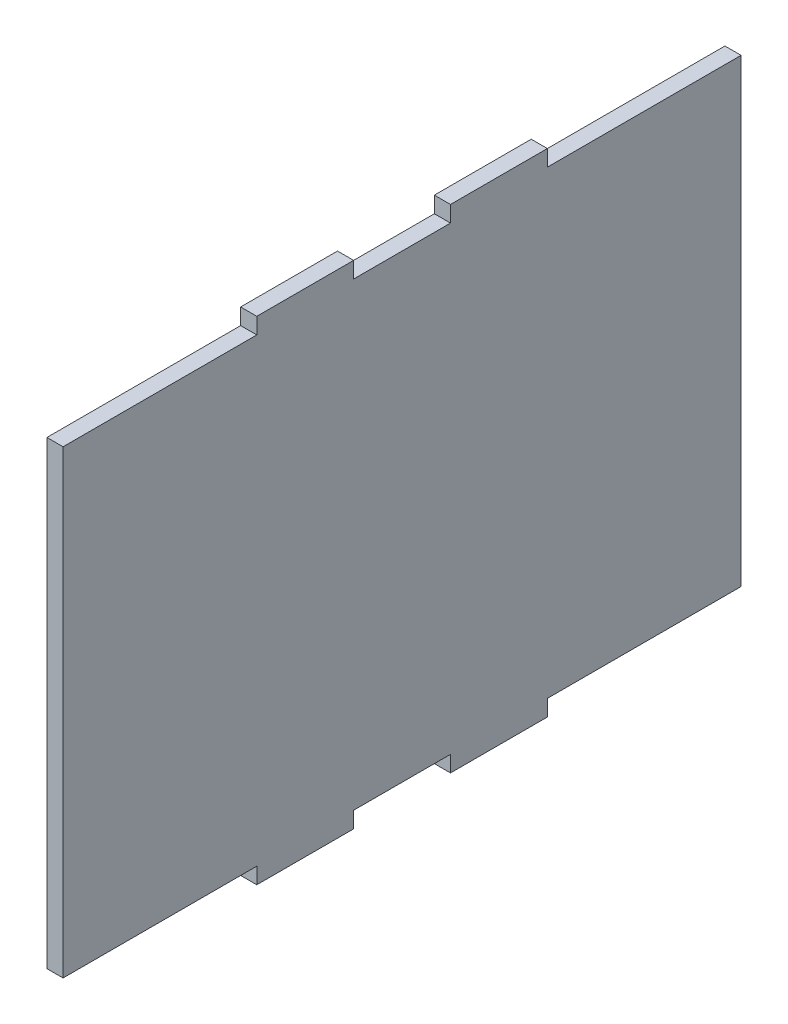
ISO-10303-21;
HEADER;
FILE_DESCRIPTION(('STEP AP214'),'2;1');
FILE_NAME('part.step','',(''),(''),'','','');
FILE_SCHEMA(('AUTOMOTIVE_DESIGN { 1 0 10303 214 1 1 1 1 }'));
ENDSEC;
DATA;
#1=APPLICATION_CONTEXT('core data for automotive mechanical design processes');
#2=APPLICATION_PROTOCOL_DEFINITION('international standard','automotive_design',2000,#1);
#3=PRODUCT_CONTEXT('',#1,'mechanical');
#4=PRODUCT('Part','Part','',(#3));
#5=PRODUCT_RELATED_PRODUCT_CATEGORY('part','',(#4));
#6=PRODUCT_DEFINITION_FORMATION('','',#4);
#7=PRODUCT_DEFINITION_CONTEXT('part definition',#1,'design');
#8=PRODUCT_DEFINITION('design','',#6,#7);
#9=PRODUCT_DEFINITION_SHAPE('','',#8);
#10=(LENGTH_UNIT() NAMED_UNIT(*) SI_UNIT(.MILLI.,.METRE.));
#11=(NAMED_UNIT(*) PLANE_ANGLE_UNIT() SI_UNIT($,.RADIAN.));
#12=(NAMED_UNIT(*) SI_UNIT($,.STERADIAN.) SOLID_ANGLE_UNIT());
#13=UNCERTAINTY_MEASURE_WITH_UNIT(LENGTH_MEASURE(1.E-05),#10,'distance_accuracy_value','');
#14=(GEOMETRIC_REPRESENTATION_CONTEXT(3) GLOBAL_UNCERTAINTY_ASSIGNED_CONTEXT((#13)) GLOBAL_UNIT_ASSIGNED_CONTEXT((#10,
#11,#12)) REPRESENTATION_CONTEXT('',''));
#15=CARTESIAN_POINT('',(0.,0.,0.));
#16=DIRECTION('',(0.,0.,1.));
#17=DIRECTION('',(1.,0.,0.));
#18=AXIS2_PLACEMENT_3D('',#15,#16,#17);
#19=CARTESIAN_POINT('',(10.,211.22153158164,328.894741548803));
#20=DIRECTION('',(0.,0.,-1.));
#21=DIRECTION('',(-1.,0.,0.));
#22=AXIS2_PLACEMENT_3D('',#19,#20,#21);
#23=PLANE('',#22);
#24=DIRECTION('',(0.,-1.,0.));
#25=VECTOR('',#24,1.);
#26=CARTESIAN_POINT('',(0.,211.22153158164,328.894741548803));
#27=LINE('',#26,#25);
#28=CARTESIAN_POINT('',(0.,211.22153158164,328.894741548803));
#29=VERTEX_POINT('',#28);
#30=CARTESIAN_POINT('',(0.,-73.7784684183598,328.894741548803));
#31=VERTEX_POINT('',#30);
#32=EDGE_CURVE('E201',#29,#31,#27,.T.);
#33=ORIENTED_EDGE('',*,*,#32,.T.);
#34=DIRECTION('',(-1.,0.,0.));
#35=VECTOR('',#34,1.);
#36=CARTESIAN_POINT('',(10.,-73.7784684183598,328.894741548803));
#37=LINE('',#36,#35);
#38=CARTESIAN_POINT('',(10.,-73.7784684183598,328.894741548803));
#39=VERTEX_POINT('',#38);
#40=EDGE_CURVE('E11',#39,#31,#37,.T.);
#41=ORIENTED_EDGE('',*,*,#40,.F.);
#42=DIRECTION('',(0.,-1.,0.));
#43=VECTOR('',#42,1.);
#44=CARTESIAN_POINT('',(10.,211.22153158164,328.894741548803));
#45=LINE('',#44,#43);
#46=CARTESIAN_POINT('',(10.,211.22153158164,328.894741548803));
#47=VERTEX_POINT('',#46);
#48=EDGE_CURVE('E239',#47,#39,#45,.T.);
#49=ORIENTED_EDGE('',*,*,#48,.F.);
#50=DIRECTION('',(-1.,0.,0.));
#51=VECTOR('',#50,1.);
#52=CARTESIAN_POINT('',(10.,211.22153158164,328.894741548803));
#53=LINE('',#52,#51);
#54=EDGE_CURVE('E197',#47,#29,#53,.T.);
#55=ORIENTED_EDGE('',*,*,#54,.T.);
#56=EDGE_LOOP('',(#33,#41,#49,#55));
#57=FACE_BOUND('',#56,.T.);
#58=ADVANCED_FACE('F33',(#57),#23,.F.);
#59=CARTESIAN_POINT('',(10.,-73.7784684183598,328.894741548803));
#60=DIRECTION('',(0.,1.,0.));
#61=DIRECTION('',(0.,0.,1.));
#62=AXIS2_PLACEMENT_3D('',#59,#60,#61);
#63=PLANE('',#62);
#64=DIRECTION('',(0.,0.,-1.));
#65=VECTOR('',#64,1.);
#66=CARTESIAN_POINT('',(0.,-73.7784684183598,328.894741548803));
#67=LINE('',#66,#65);
#68=CARTESIAN_POINT('',(0.,-73.7784684183598,208.894741548803));
#69=VERTEX_POINT('',#68);
#70=EDGE_CURVE('E204',#31,#69,#67,.T.);
#71=ORIENTED_EDGE('',*,*,#70,.T.);
#72=DIRECTION('',(-1.,0.,0.));
#73=VECTOR('',#72,1.);
#74=CARTESIAN_POINT('',(10.,-73.7784684183598,208.894741548803));
#75=LINE('',#74,#73);
#76=CARTESIAN_POINT('',(10.,-73.7784684183598,208.894741548803));
#77=VERTEX_POINT('',#76);
#78=EDGE_CURVE('E41',#77,#69,#75,.T.);
#79=ORIENTED_EDGE('',*,*,#78,.F.);
#80=DIRECTION('',(0.,0.,-1.));
#81=VECTOR('',#80,1.);
#82=CARTESIAN_POINT('',(10.,-73.7784684183598,328.894741548803));
#83=LINE('',#82,#81);
#84=EDGE_CURVE('E128',#39,#77,#83,.T.);
#85=ORIENTED_EDGE('',*,*,#84,.F.);
#86=ORIENTED_EDGE('',*,*,#40,.T.);
#87=EDGE_LOOP('',(#71,#79,#85,#86));
#88=FACE_BOUND('',#87,.T.);
#89=ADVANCED_FACE('F357',(#88),#63,.F.);
#90=CARTESIAN_POINT('',(10.,-73.7784684183598,208.894741548803));
#91=DIRECTION('',(0.,0.,-1.));
#92=DIRECTION('',(-1.,0.,0.));
#93=AXIS2_PLACEMENT_3D('',#90,#91,#92);
#94=PLANE('',#93);
#95=DIRECTION('',(0.,-1.,0.));
#96=VECTOR('',#95,1.);
#97=CARTESIAN_POINT('',(0.,-73.7784684183598,208.894741548803));
#98=LINE('',#97,#96);
#99=CARTESIAN_POINT('',(0.,-83.7784684183598,208.894741548803));
#100=VERTEX_POINT('',#99);
#101=EDGE_CURVE('E206',#69,#100,#98,.T.);
#102=ORIENTED_EDGE('',*,*,#101,.T.);
#103=DIRECTION('',(-1.,0.,0.));
#104=VECTOR('',#103,1.);
#105=CARTESIAN_POINT('',(10.,-83.7784684183598,208.894741548803));
#106=LINE('',#105,#104);
#107=CARTESIAN_POINT('',(10.,-83.7784684183598,208.894741548803));
#108=VERTEX_POINT('',#107);
#109=EDGE_CURVE('E282',#108,#100,#106,.T.);
#110=ORIENTED_EDGE('',*,*,#109,.F.);
#111=DIRECTION('',(0.,-1.,0.));
#112=VECTOR('',#111,1.);
#113=CARTESIAN_POINT('',(10.,-73.7784684183598,208.894741548803));
#114=LINE('',#113,#112);
#115=EDGE_CURVE('E290',#77,#108,#114,.T.);
#116=ORIENTED_EDGE('',*,*,#115,.F.);
#117=ORIENTED_EDGE('',*,*,#78,.T.);
#118=EDGE_LOOP('',(#102,#110,#116,#117));
#119=FACE_BOUND('',#118,.T.);
#120=ADVANCED_FACE('F288',(#119),#94,.F.);
#121=CARTESIAN_POINT('',(10.,-83.7784684183598,208.894741548803));
#122=DIRECTION('',(0.,1.,0.));
#123=DIRECTION('',(0.,0.,1.));
#124=AXIS2_PLACEMENT_3D('',#121,#122,#123);
#125=PLANE('',#124);
#126=DIRECTION('',(0.,0.,-1.));
#127=VECTOR('',#126,1.);
#128=CARTESIAN_POINT('',(0.,-83.7784684183598,208.894741548803));
#129=LINE('',#128,#127);
#130=CARTESIAN_POINT('',(0.,-83.7784684183598,148.894741548803));
#131=VERTEX_POINT('',#130);
#132=EDGE_CURVE('E208',#100,#131,#129,.T.);
#133=ORIENTED_EDGE('',*,*,#132,.T.);
#134=DIRECTION('',(-1.,0.,0.));
#135=VECTOR('',#134,1.);
#136=CARTESIAN_POINT('',(10.,-83.7784684183598,148.894741548803));
#137=LINE('',#136,#135);
#138=CARTESIAN_POINT('',(10.,-83.7784684183598,148.894741548803));
#139=VERTEX_POINT('',#138);
#140=EDGE_CURVE('E279',#139,#131,#137,.T.);
#141=ORIENTED_EDGE('',*,*,#140,.F.);
#142=DIRECTION('',(0.,0.,-1.));
#143=VECTOR('',#142,1.);
#144=CARTESIAN_POINT('',(10.,-83.7784684183598,208.894741548803));
#145=LINE('',#144,#143);
#146=EDGE_CURVE('E308',#108,#139,#145,.T.);
#147=ORIENTED_EDGE('',*,*,#146,.F.);
#148=ORIENTED_EDGE('',*,*,#109,.T.);
#149=EDGE_LOOP('',(#133,#141,#147,#148));
#150=FACE_BOUND('',#149,.T.);
#151=ADVANCED_FACE('F299',(#150),#125,.F.);
#152=CARTESIAN_POINT('',(10.,-83.7784684183598,148.894741548803));
#153=DIRECTION('',(0.,0.,1.));
#154=DIRECTION('',(1.,0.,0.));
#155=AXIS2_PLACEMENT_3D('',#152,#153,#154);
#156=PLANE('',#155);
#157=DIRECTION('',(0.,1.,0.));
#158=VECTOR('',#157,1.);
#159=CARTESIAN_POINT('',(0.,-83.7784684183598,148.894741548803));
#160=LINE('',#159,#158);
#161=CARTESIAN_POINT('',(0.,-73.7784684183598,148.894741548803));
#162=VERTEX_POINT('',#161);
#163=EDGE_CURVE('E210',#131,#162,#160,.T.);
#164=ORIENTED_EDGE('',*,*,#163,.T.);
#165=DIRECTION('',(-1.,0.,0.));
#166=VECTOR('',#165,1.);
#167=CARTESIAN_POINT('',(10.,-73.7784684183598,148.894741548803));
#168=LINE('',#167,#166);
#169=CARTESIAN_POINT('',(10.,-73.7784684183598,148.894741548803));
#170=VERTEX_POINT('',#169);
#171=EDGE_CURVE('E276',#170,#162,#168,.T.);
#172=ORIENTED_EDGE('',*,*,#171,.F.);
#173=DIRECTION('',(0.,1.,0.));
#174=VECTOR('',#173,1.);
#175=CARTESIAN_POINT('',(10.,-83.7784684183598,148.894741548803));
#176=LINE('',#175,#174);
#177=EDGE_CURVE('E305',#139,#170,#176,.T.);
#178=ORIENTED_EDGE('',*,*,#177,.F.);
#179=ORIENTED_EDGE('',*,*,#140,.T.);
#180=EDGE_LOOP('',(#164,#172,#178,#179));
#181=FACE_BOUND('',#180,.T.);
#182=ADVANCED_FACE('F303',(#181),#156,.F.);
#183=CARTESIAN_POINT('',(10.,-73.7784684183598,148.894741548803));
#184=DIRECTION('',(0.,1.,0.));
#185=DIRECTION('',(0.,0.,1.));
#186=AXIS2_PLACEMENT_3D('',#183,#184,#185);
#187=PLANE('',#186);
#188=DIRECTION('',(0.,0.,-1.));
#189=VECTOR('',#188,1.);
#190=CARTESIAN_POINT('',(0.,-73.7784684183598,148.894741548803));
#191=LINE('',#190,#189);
#192=CARTESIAN_POINT('',(0.,-73.7784684183598,88.8947415488026));
#193=VERTEX_POINT('',#192);
#194=EDGE_CURVE('E212',#162,#193,#191,.T.);
#195=ORIENTED_EDGE('',*,*,#194,.T.);
#196=DIRECTION('',(-1.,0.,0.));
#197=VECTOR('',#196,1.);
#198=CARTESIAN_POINT('',(10.,-73.7784684183598,88.8947415488026));
#199=LINE('',#198,#197);
#200=CARTESIAN_POINT('',(10.,-73.7784684183598,88.8947415488026));
#201=VERTEX_POINT('',#200);
#202=EDGE_CURVE('E273',#201,#193,#199,.T.);
#203=ORIENTED_EDGE('',*,*,#202,.F.);
#204=DIRECTION('',(0.,0.,-1.));
#205=VECTOR('',#204,1.);
#206=CARTESIAN_POINT('',(10.,-73.7784684183598,148.894741548803));
#207=LINE('',#206,#205);
#208=EDGE_CURVE('E307',#170,#201,#207,.T.);
#209=ORIENTED_EDGE('',*,*,#208,.F.);
#210=ORIENTED_EDGE('',*,*,#171,.T.);
#211=EDGE_LOOP('',(#195,#203,#209,#210));
#212=FACE_BOUND('',#211,.T.);
#213=ADVANCED_FACE('F370',(#212),#187,.F.);
#214=CARTESIAN_POINT('',(10.,-73.7784684183598,88.8947415488026));
#215=DIRECTION('',(0.,0.,-1.));
#216=DIRECTION('',(-1.,0.,0.));
#217=AXIS2_PLACEMENT_3D('',#214,#215,#216);
#218=PLANE('',#217);
#219=DIRECTION('',(0.,-1.,0.));
#220=VECTOR('',#219,1.);
#221=CARTESIAN_POINT('',(0.,-73.7784684183598,88.8947415488026));
#222=LINE('',#221,#220);
#223=CARTESIAN_POINT('',(0.,-83.7784684183598,88.8947415488026));
#224=VERTEX_POINT('',#223);
#225=EDGE_CURVE('E214',#193,#224,#222,.T.);
#226=ORIENTED_EDGE('',*,*,#225,.T.);
#227=DIRECTION('',(-1.,0.,0.));
#228=VECTOR('',#227,1.);
#229=CARTESIAN_POINT('',(10.,-83.7784684183598,88.8947415488026));
#230=LINE('',#229,#228);
#231=CARTESIAN_POINT('',(10.,-83.7784684183598,88.8947415488026));
#232=VERTEX_POINT('',#231);
#233=EDGE_CURVE('E270',#232,#224,#230,.T.);
#234=ORIENTED_EDGE('',*,*,#233,.F.);
#235=DIRECTION('',(0.,-1.,0.));
#236=VECTOR('',#235,1.);
#237=CARTESIAN_POINT('',(10.,-73.7784684183598,88.8947415488026));
#238=LINE('',#237,#236);
#239=EDGE_CURVE('E310',#201,#232,#238,.T.);
#240=ORIENTED_EDGE('',*,*,#239,.F.);
#241=ORIENTED_EDGE('',*,*,#202,.T.);
#242=EDGE_LOOP('',(#226,#234,#240,#241));
#243=FACE_BOUND('',#242,.T.);
#244=ADVANCED_FACE('F373',(#243),#218,.F.);
#245=CARTESIAN_POINT('',(10.,-83.7784684183598,88.8947415488026));
#246=DIRECTION('',(0.,1.,0.));
#247=DIRECTION('',(0.,0.,1.));
#248=AXIS2_PLACEMENT_3D('',#245,#246,#247);
#249=PLANE('',#248);
#250=DIRECTION('',(0.,0.,-1.));
#251=VECTOR('',#250,1.);
#252=CARTESIAN_POINT('',(0.,-83.7784684183598,88.8947415488026));
#253=LINE('',#252,#251);
#254=CARTESIAN_POINT('',(0.,-83.7784684183598,28.8947415488026));
#255=VERTEX_POINT('',#254);
#256=EDGE_CURVE('E216',#224,#255,#253,.T.);
#257=ORIENTED_EDGE('',*,*,#256,.T.);
#258=DIRECTION('',(-1.,0.,0.));
#259=VECTOR('',#258,1.);
#260=CARTESIAN_POINT('',(10.,-83.7784684183598,28.8947415488026));
#261=LINE('',#260,#259);
#262=CARTESIAN_POINT('',(10.,-83.7784684183598,28.8947415488026));
#263=VERTEX_POINT('',#262);
#264=EDGE_CURVE('E267',#263,#255,#261,.T.);
#265=ORIENTED_EDGE('',*,*,#264,.F.);
#266=DIRECTION('',(0.,0.,-1.));
#267=VECTOR('',#266,1.);
#268=CARTESIAN_POINT('',(10.,-83.7784684183598,88.8947415488026));
#269=LINE('',#268,#267);
#270=EDGE_CURVE('E316',#232,#263,#269,.T.);
#271=ORIENTED_EDGE('',*,*,#270,.F.);
#272=ORIENTED_EDGE('',*,*,#233,.T.);
#273=EDGE_LOOP('',(#257,#265,#271,#272));
#274=FACE_BOUND('',#273,.T.);
#275=ADVANCED_FACE('F377',(#274),#249,.F.);
#276=CARTESIAN_POINT('',(10.,-83.7784684183598,28.8947415488026));
#277=DIRECTION('',(0.,0.,1.));
#278=DIRECTION('',(1.,0.,0.));
#279=AXIS2_PLACEMENT_3D('',#276,#277,#278);
#280=PLANE('',#279);
#281=DIRECTION('',(0.,1.,0.));
#282=VECTOR('',#281,1.);
#283=CARTESIAN_POINT('',(0.,-83.7784684183598,28.8947415488026));
#284=LINE('',#283,#282);
#285=CARTESIAN_POINT('',(0.,-73.7784684183598,28.8947415488026));
#286=VERTEX_POINT('',#285);
#287=EDGE_CURVE('E218',#255,#286,#284,.T.);
#288=ORIENTED_EDGE('',*,*,#287,.T.);
#289=DIRECTION('',(-1.,0.,0.));
#290=VECTOR('',#289,1.);
#291=CARTESIAN_POINT('',(10.,-73.7784684183598,28.8947415488026));
#292=LINE('',#291,#290);
#293=CARTESIAN_POINT('',(10.,-73.7784684183598,28.8947415488026));
#294=VERTEX_POINT('',#293);
#295=EDGE_CURVE('E264',#294,#286,#292,.T.);
#296=ORIENTED_EDGE('',*,*,#295,.F.);
#297=DIRECTION('',(0.,1.,0.));
#298=VECTOR('',#297,1.);
#299=CARTESIAN_POINT('',(10.,-83.7784684183598,28.8947415488026));
#300=LINE('',#299,#298);
#301=EDGE_CURVE('E318',#263,#294,#300,.T.);
#302=ORIENTED_EDGE('',*,*,#301,.F.);
#303=ORIENTED_EDGE('',*,*,#264,.T.);
#304=EDGE_LOOP('',(#288,#296,#302,#303));
#305=FACE_BOUND('',#304,.T.);
#306=ADVANCED_FACE('F381',(#305),#280,.F.);
#307=CARTESIAN_POINT('',(10.,-73.7784684183598,28.8947415488026));
#308=DIRECTION('',(0.,1.,0.));
#309=DIRECTION('',(0.,0.,1.));
#310=AXIS2_PLACEMENT_3D('',#307,#308,#309);
#311=PLANE('',#310);
#312=DIRECTION('',(0.,0.,-1.));
#313=VECTOR('',#312,1.);
#314=CARTESIAN_POINT('',(0.,-73.7784684183598,28.8947415488026));
#315=LINE('',#314,#313);
#316=CARTESIAN_POINT('',(0.,-73.7784684183598,-91.1052584511975));
#317=VERTEX_POINT('',#316);
#318=EDGE_CURVE('E220',#286,#317,#315,.T.);
#319=ORIENTED_EDGE('',*,*,#318,.T.);
#320=DIRECTION('',(-1.,0.,0.));
#321=VECTOR('',#320,1.);
#322=CARTESIAN_POINT('',(10.,-73.7784684183598,-91.1052584511975));
#323=LINE('',#322,#321);
#324=CARTESIAN_POINT('',(10.,-73.7784684183598,-91.1052584511975));
#325=VERTEX_POINT('',#324);
#326=EDGE_CURVE('E261',#325,#317,#323,.T.);
#327=ORIENTED_EDGE('',*,*,#326,.F.);
#328=DIRECTION('',(0.,0.,-1.));
#329=VECTOR('',#328,1.);
#330=CARTESIAN_POINT('',(10.,-73.7784684183598,28.8947415488026));
#331=LINE('',#330,#329);
#332=EDGE_CURVE('E320',#294,#325,#331,.T.);
#333=ORIENTED_EDGE('',*,*,#332,.F.);
#334=ORIENTED_EDGE('',*,*,#295,.T.);
#335=EDGE_LOOP('',(#319,#327,#333,#334));
#336=FACE_BOUND('',#335,.T.);
#337=ADVANCED_FACE('F385',(#336),#311,.F.);
#338=CARTESIAN_POINT('',(10.,211.22153158164,-91.1052584511975));
#339=DIRECTION('',(0.,0.,1.));
#340=DIRECTION('',(1.,0.,0.));
#341=AXIS2_PLACEMENT_3D('',#338,#339,#340);
#342=PLANE('',#341);
#343=DIRECTION('',(0.,1.,0.));
#344=VECTOR('',#343,1.);
#345=CARTESIAN_POINT('',(0.,211.22153158164,-91.1052584511975));
#346=LINE('',#345,#344);
#347=CARTESIAN_POINT('',(0.,211.22153158164,-91.1052584511975));
#348=VERTEX_POINT('',#347);
#349=EDGE_CURVE('E222',#317,#348,#346,.T.);
#350=ORIENTED_EDGE('',*,*,#349,.T.);
#351=DIRECTION('',(-1.,0.,0.));
#352=VECTOR('',#351,1.);
#353=CARTESIAN_POINT('',(10.,211.22153158164,-91.1052584511975));
#354=LINE('',#353,#352);
#355=CARTESIAN_POINT('',(10.,211.22153158164,-91.1052584511975));
#356=VERTEX_POINT('',#355);
#357=EDGE_CURVE('E258',#356,#348,#354,.T.);
#358=ORIENTED_EDGE('',*,*,#357,.F.);
#359=DIRECTION('',(0.,1.,0.));
#360=VECTOR('',#359,1.);
#361=CARTESIAN_POINT('',(10.,211.22153158164,-91.1052584511975));
#362=LINE('',#361,#360);
#363=EDGE_CURVE('E322',#325,#356,#362,.T.);
#364=ORIENTED_EDGE('',*,*,#363,.F.);
#365=ORIENTED_EDGE('',*,*,#326,.T.);
#366=EDGE_LOOP('',(#350,#358,#364,#365));
#367=FACE_BOUND('',#366,.T.);
#368=ADVANCED_FACE('F389',(#367),#342,.F.);
#369=CARTESIAN_POINT('',(10.,211.22153158164,28.8947415488026));
#370=DIRECTION('',(0.,-1.,0.));
#371=DIRECTION('',(0.,0.,-1.));
#372=AXIS2_PLACEMENT_3D('',#369,#370,#371);
#373=PLANE('',#372);
#374=DIRECTION('',(0.,0.,1.));
#375=VECTOR('',#374,1.);
#376=CARTESIAN_POINT('',(0.,211.22153158164,28.8947415488026));
#377=LINE('',#376,#375);
#378=CARTESIAN_POINT('',(0.,211.22153158164,28.8947415488026));
#379=VERTEX_POINT('',#378);
#380=EDGE_CURVE('E224',#348,#379,#377,.T.);
#381=ORIENTED_EDGE('',*,*,#380,.T.);
#382=DIRECTION('',(-1.,0.,0.));
#383=VECTOR('',#382,1.);
#384=CARTESIAN_POINT('',(10.,211.22153158164,28.8947415488026));
#385=LINE('',#384,#383);
#386=CARTESIAN_POINT('',(10.,211.22153158164,28.8947415488026));
#387=VERTEX_POINT('',#386);
#388=EDGE_CURVE('E255',#387,#379,#385,.T.);
#389=ORIENTED_EDGE('',*,*,#388,.F.);
#390=DIRECTION('',(0.,0.,1.));
#391=VECTOR('',#390,1.);
#392=CARTESIAN_POINT('',(10.,211.22153158164,28.8947415488026));
#393=LINE('',#392,#391);
#394=EDGE_CURVE('E324',#356,#387,#393,.T.);
#395=ORIENTED_EDGE('',*,*,#394,.F.);
#396=ORIENTED_EDGE('',*,*,#357,.T.);
#397=EDGE_LOOP('',(#381,#389,#395,#396));
#398=FACE_BOUND('',#397,.T.);
#399=ADVANCED_FACE('F393',(#398),#373,.F.);
#400=CARTESIAN_POINT('',(10.,221.22153158164,28.8947415488026));
#401=DIRECTION('',(0.,0.,1.));
#402=DIRECTION('',(1.,0.,0.));
#403=AXIS2_PLACEMENT_3D('',#400,#401,#402);
#404=PLANE('',#403);
#405=DIRECTION('',(0.,1.,0.));
#406=VECTOR('',#405,1.);
#407=CARTESIAN_POINT('',(0.,221.22153158164,28.8947415488026));
#408=LINE('',#407,#406);
#409=CARTESIAN_POINT('',(0.,221.22153158164,28.8947415488026));
#410=VERTEX_POINT('',#409);
#411=EDGE_CURVE('E226',#379,#410,#408,.T.);
#412=ORIENTED_EDGE('',*,*,#411,.T.);
#413=DIRECTION('',(-1.,0.,0.));
#414=VECTOR('',#413,1.);
#415=CARTESIAN_POINT('',(10.,221.22153158164,28.8947415488026));
#416=LINE('',#415,#414);
#417=CARTESIAN_POINT('',(10.,221.22153158164,28.8947415488026));
#418=VERTEX_POINT('',#417);
#419=EDGE_CURVE('E252',#418,#410,#416,.T.);
#420=ORIENTED_EDGE('',*,*,#419,.F.);
#421=DIRECTION('',(0.,1.,0.));
#422=VECTOR('',#421,1.);
#423=CARTESIAN_POINT('',(10.,221.22153158164,28.8947415488026));
#424=LINE('',#423,#422);
#425=EDGE_CURVE('E326',#387,#418,#424,.T.);
#426=ORIENTED_EDGE('',*,*,#425,.F.);
#427=ORIENTED_EDGE('',*,*,#388,.T.);
#428=EDGE_LOOP('',(#412,#420,#426,#427));
#429=FACE_BOUND('',#428,.T.);
#430=ADVANCED_FACE('F397',(#429),#404,.F.);
#431=CARTESIAN_POINT('',(10.,221.22153158164,88.8947415488026));
#432=DIRECTION('',(0.,-1.,0.));
#433=DIRECTION('',(0.,0.,-1.));
#434=AXIS2_PLACEMENT_3D('',#431,#432,#433);
#435=PLANE('',#434);
#436=DIRECTION('',(0.,0.,1.));
#437=VECTOR('',#436,1.);
#438=CARTESIAN_POINT('',(0.,221.22153158164,88.8947415488026));
#439=LINE('',#438,#437);
#440=CARTESIAN_POINT('',(0.,221.22153158164,88.8947415488026));
#441=VERTEX_POINT('',#440);
#442=EDGE_CURVE('E228',#410,#441,#439,.T.);
#443=ORIENTED_EDGE('',*,*,#442,.T.);
#444=DIRECTION('',(-1.,0.,0.));
#445=VECTOR('',#444,1.);
#446=CARTESIAN_POINT('',(10.,221.22153158164,88.8947415488026));
#447=LINE('',#446,#445);
#448=CARTESIAN_POINT('',(10.,221.22153158164,88.8947415488026));
#449=VERTEX_POINT('',#448);
#450=EDGE_CURVE('E249',#449,#441,#447,.T.);
#451=ORIENTED_EDGE('',*,*,#450,.F.);
#452=DIRECTION('',(0.,0.,1.));
#453=VECTOR('',#452,1.);
#454=CARTESIAN_POINT('',(10.,221.22153158164,88.8947415488026));
#455=LINE('',#454,#453);
#456=EDGE_CURVE('E328',#418,#449,#455,.T.);
#457=ORIENTED_EDGE('',*,*,#456,.F.);
#458=ORIENTED_EDGE('',*,*,#419,.T.);
#459=EDGE_LOOP('',(#443,#451,#457,#458));
#460=FACE_BOUND('',#459,.T.);
#461=ADVANCED_FACE('F401',(#460),#435,.F.);
#462=CARTESIAN_POINT('',(10.,211.22153158164,88.8947415488026));
#463=DIRECTION('',(0.,0.,-1.));
#464=DIRECTION('',(-1.,0.,0.));
#465=AXIS2_PLACEMENT_3D('',#462,#463,#464);
#466=PLANE('',#465);
#467=DIRECTION('',(0.,-1.,0.));
#468=VECTOR('',#467,1.);
#469=CARTESIAN_POINT('',(0.,211.22153158164,88.8947415488026));
#470=LINE('',#469,#468);
#471=CARTESIAN_POINT('',(0.,211.22153158164,88.8947415488026));
#472=VERTEX_POINT('',#471);
#473=EDGE_CURVE('E230',#441,#472,#470,.T.);
#474=ORIENTED_EDGE('',*,*,#473,.T.);
#475=DIRECTION('',(-1.,0.,0.));
#476=VECTOR('',#475,1.);
#477=CARTESIAN_POINT('',(10.,211.22153158164,88.8947415488026));
#478=LINE('',#477,#476);
#479=CARTESIAN_POINT('',(10.,211.22153158164,88.8947415488026));
#480=VERTEX_POINT('',#479);
#481=EDGE_CURVE('E246',#480,#472,#478,.T.);
#482=ORIENTED_EDGE('',*,*,#481,.F.);
#483=DIRECTION('',(0.,-1.,0.));
#484=VECTOR('',#483,1.);
#485=CARTESIAN_POINT('',(10.,211.22153158164,88.8947415488026));
#486=LINE('',#485,#484);
#487=EDGE_CURVE('E330',#449,#480,#486,.T.);
#488=ORIENTED_EDGE('',*,*,#487,.F.);
#489=ORIENTED_EDGE('',*,*,#450,.T.);
#490=EDGE_LOOP('',(#474,#482,#488,#489));
#491=FACE_BOUND('',#490,.T.);
#492=ADVANCED_FACE('F405',(#491),#466,.F.);
#493=CARTESIAN_POINT('',(10.,211.22153158164,148.894741548803));
#494=DIRECTION('',(0.,-1.,0.));
#495=DIRECTION('',(0.,0.,-1.));
#496=AXIS2_PLACEMENT_3D('',#493,#494,#495);
#497=PLANE('',#496);
#498=DIRECTION('',(0.,0.,1.));
#499=VECTOR('',#498,1.);
#500=CARTESIAN_POINT('',(0.,211.22153158164,148.894741548803));
#501=LINE('',#500,#499);
#502=CARTESIAN_POINT('',(0.,211.22153158164,148.894741548803));
#503=VERTEX_POINT('',#502);
#504=EDGE_CURVE('E232',#472,#503,#501,.T.);
#505=ORIENTED_EDGE('',*,*,#504,.T.);
#506=DIRECTION('',(-1.,0.,0.));
#507=VECTOR('',#506,1.);
#508=CARTESIAN_POINT('',(10.,211.22153158164,148.894741548803));
#509=LINE('',#508,#507);
#510=CARTESIAN_POINT('',(10.,211.22153158164,148.894741548803));
#511=VERTEX_POINT('',#510);
#512=EDGE_CURVE('E243',#511,#503,#509,.T.);
#513=ORIENTED_EDGE('',*,*,#512,.F.);
#514=DIRECTION('',(0.,0.,1.));
#515=VECTOR('',#514,1.);
#516=CARTESIAN_POINT('',(10.,211.22153158164,148.894741548803));
#517=LINE('',#516,#515);
#518=EDGE_CURVE('E332',#480,#511,#517,.T.);
#519=ORIENTED_EDGE('',*,*,#518,.F.);
#520=ORIENTED_EDGE('',*,*,#481,.T.);
#521=EDGE_LOOP('',(#505,#513,#519,#520));
#522=FACE_BOUND('',#521,.T.);
#523=ADVANCED_FACE('F338',(#522),#497,.F.);
#524=CARTESIAN_POINT('',(10.,221.22153158164,148.894741548803));
#525=DIRECTION('',(0.,0.,1.));
#526=DIRECTION('',(1.,0.,0.));
#527=AXIS2_PLACEMENT_3D('',#524,#525,#526);
#528=PLANE('',#527);
#529=DIRECTION('',(0.,1.,0.));
#530=VECTOR('',#529,1.);
#531=CARTESIAN_POINT('',(0.,221.22153158164,148.894741548803));
#532=LINE('',#531,#530);
#533=CARTESIAN_POINT('',(0.,221.22153158164,148.894741548803));
#534=VERTEX_POINT('',#533);
#535=EDGE_CURVE('E234',#503,#534,#532,.T.);
#536=ORIENTED_EDGE('',*,*,#535,.T.);
#537=DIRECTION('',(-1.,0.,0.));
#538=VECTOR('',#537,1.);
#539=CARTESIAN_POINT('',(10.,221.22153158164,148.894741548803));
#540=LINE('',#539,#538);
#541=CARTESIAN_POINT('',(10.,221.22153158164,148.894741548803));
#542=VERTEX_POINT('',#541);
#543=EDGE_CURVE('E192',#542,#534,#540,.T.);
#544=ORIENTED_EDGE('',*,*,#543,.F.);
#545=DIRECTION('',(0.,1.,0.));
#546=VECTOR('',#545,1.);
#547=CARTESIAN_POINT('',(10.,221.22153158164,148.894741548803));
#548=LINE('',#547,#546);
#549=EDGE_CURVE('E183',#511,#542,#548,.T.);
#550=ORIENTED_EDGE('',*,*,#549,.F.);
#551=ORIENTED_EDGE('',*,*,#512,.T.);
#552=EDGE_LOOP('',(#536,#544,#550,#551));
#553=FACE_BOUND('',#552,.T.);
#554=ADVANCED_FACE('F342',(#553),#528,.F.);
#555=CARTESIAN_POINT('',(10.,221.22153158164,208.894741548803));
#556=DIRECTION('',(0.,-1.,0.));
#557=DIRECTION('',(0.,0.,-1.));
#558=AXIS2_PLACEMENT_3D('',#555,#556,#557);
#559=PLANE('',#558);
#560=DIRECTION('',(0.,0.,1.));
#561=VECTOR('',#560,1.);
#562=CARTESIAN_POINT('',(0.,221.22153158164,208.894741548803));
#563=LINE('',#562,#561);
#564=CARTESIAN_POINT('',(0.,221.22153158164,208.894741548803));
#565=VERTEX_POINT('',#564);
#566=EDGE_CURVE('E191',#534,#565,#563,.T.);
#567=ORIENTED_EDGE('',*,*,#566,.T.);
#568=DIRECTION('',(-1.,0.,0.));
#569=VECTOR('',#568,1.);
#570=CARTESIAN_POINT('',(10.,221.22153158164,208.894741548803));
#571=LINE('',#570,#569);
#572=CARTESIAN_POINT('',(10.,221.22153158164,208.894741548803));
#573=VERTEX_POINT('',#572);
#574=EDGE_CURVE('E188',#573,#565,#571,.T.);
#575=ORIENTED_EDGE('',*,*,#574,.F.);
#576=DIRECTION('',(0.,0.,1.));
#577=VECTOR('',#576,1.);
#578=CARTESIAN_POINT('',(10.,221.22153158164,208.894741548803));
#579=LINE('',#578,#577);
#580=EDGE_CURVE('E177',#542,#573,#579,.T.);
#581=ORIENTED_EDGE('',*,*,#580,.F.);
#582=ORIENTED_EDGE('',*,*,#543,.T.);
#583=EDGE_LOOP('',(#567,#575,#581,#582));
#584=FACE_BOUND('',#583,.T.);
#585=ADVANCED_FACE('F189',(#584),#559,.F.);
#586=CARTESIAN_POINT('',(10.,211.22153158164,208.894741548803));
#587=DIRECTION('',(0.,0.,-1.));
#588=DIRECTION('',(-1.,0.,0.));
#589=AXIS2_PLACEMENT_3D('',#586,#587,#588);
#590=PLANE('',#589);
#591=DIRECTION('',(0.,-1.,0.));
#592=VECTOR('',#591,1.);
#593=CARTESIAN_POINT('',(0.,211.22153158164,208.894741548803));
#594=LINE('',#593,#592);
#595=CARTESIAN_POINT('',(0.,211.22153158164,208.894741548803));
#596=VERTEX_POINT('',#595);
#597=EDGE_CURVE('E114',#565,#596,#594,.T.);
#598=ORIENTED_EDGE('',*,*,#597,.T.);
#599=DIRECTION('',(-1.,0.,0.));
#600=VECTOR('',#599,1.);
#601=CARTESIAN_POINT('',(10.,211.22153158164,208.894741548803));
#602=LINE('',#601,#600);
#603=CARTESIAN_POINT('',(10.,211.22153158164,208.894741548803));
#604=VERTEX_POINT('',#603);
#605=EDGE_CURVE('E193',#604,#596,#602,.T.);
#606=ORIENTED_EDGE('',*,*,#605,.F.);
#607=DIRECTION('',(0.,-1.,0.));
#608=VECTOR('',#607,1.);
#609=CARTESIAN_POINT('',(10.,211.22153158164,208.894741548803));
#610=LINE('',#609,#608);
#611=EDGE_CURVE('E181',#573,#604,#610,.T.);
#612=ORIENTED_EDGE('',*,*,#611,.F.);
#613=ORIENTED_EDGE('',*,*,#574,.T.);
#614=EDGE_LOOP('',(#598,#606,#612,#613));
#615=FACE_BOUND('',#614,.T.);
#616=ADVANCED_FACE('F195',(#615),#590,.F.);
#617=CARTESIAN_POINT('',(10.,211.22153158164,328.894741548803));
#618=DIRECTION('',(0.,-1.,0.));
#619=DIRECTION('',(0.,0.,-1.));
#620=AXIS2_PLACEMENT_3D('',#617,#618,#619);
#621=PLANE('',#620);
#622=DIRECTION('',(0.,0.,1.));
#623=VECTOR('',#622,1.);
#624=CARTESIAN_POINT('',(0.,211.22153158164,328.894741548803));
#625=LINE('',#624,#623);
#626=EDGE_CURVE('E120',#596,#29,#625,.T.);
#627=ORIENTED_EDGE('',*,*,#626,.T.);
#628=ORIENTED_EDGE('',*,*,#54,.F.);
#629=DIRECTION('',(0.,0.,1.));
#630=VECTOR('',#629,1.);
#631=CARTESIAN_POINT('',(10.,211.22153158164,328.894741548803));
#632=LINE('',#631,#630);
#633=EDGE_CURVE('E49',#604,#47,#632,.T.);
#634=ORIENTED_EDGE('',*,*,#633,.F.);
#635=ORIENTED_EDGE('',*,*,#605,.T.);
#636=EDGE_LOOP('',(#627,#628,#634,#635));
#637=FACE_BOUND('',#636,.T.);
#638=ADVANCED_FACE('F346',(#637),#621,.F.);
#639=CARTESIAN_POINT('',(10.,0.,0.));
#640=DIRECTION('',(1.,0.,0.));
#641=DIRECTION('',(0.,0.,-1.));
#642=AXIS2_PLACEMENT_3D('',#639,#640,#641);
#643=PLANE('',#642);
#644=ORIENTED_EDGE('',*,*,#48,.T.);
#645=ORIENTED_EDGE('',*,*,#84,.T.);
#646=ORIENTED_EDGE('',*,*,#115,.T.);
#647=ORIENTED_EDGE('',*,*,#146,.T.);
#648=ORIENTED_EDGE('',*,*,#177,.T.);
#649=ORIENTED_EDGE('',*,*,#208,.T.);
#650=ORIENTED_EDGE('',*,*,#239,.T.);
#651=ORIENTED_EDGE('',*,*,#270,.T.);
#652=ORIENTED_EDGE('',*,*,#301,.T.);
#653=ORIENTED_EDGE('',*,*,#332,.T.);
#654=ORIENTED_EDGE('',*,*,#363,.T.);
#655=ORIENTED_EDGE('',*,*,#394,.T.);
#656=ORIENTED_EDGE('',*,*,#425,.T.);
#657=ORIENTED_EDGE('',*,*,#456,.T.);
#658=ORIENTED_EDGE('',*,*,#487,.T.);
#659=ORIENTED_EDGE('',*,*,#518,.T.);
#660=ORIENTED_EDGE('',*,*,#549,.T.);
#661=ORIENTED_EDGE('',*,*,#580,.T.);
#662=ORIENTED_EDGE('',*,*,#611,.T.);
#663=ORIENTED_EDGE('',*,*,#633,.T.);
#664=EDGE_LOOP('',(#644,#645,#646,#647,#648,#649,#650,#651,#652,#653,#654,#655,#656,#657,#658,
#659,#660,#661,#662,#663));
#665=FACE_BOUND('',#664,.T.);
#666=ADVANCED_FACE('F179',(#665),#643,.T.);
#667=CARTESIAN_POINT('',(0.,0.,0.));
#668=DIRECTION('',(1.,0.,0.));
#669=DIRECTION('',(0.,0.,-1.));
#670=AXIS2_PLACEMENT_3D('',#667,#668,#669);
#671=PLANE('',#670);
#672=ORIENTED_EDGE('',*,*,#32,.F.);
#673=ORIENTED_EDGE('',*,*,#626,.F.);
#674=ORIENTED_EDGE('',*,*,#597,.F.);
#675=ORIENTED_EDGE('',*,*,#566,.F.);
#676=ORIENTED_EDGE('',*,*,#535,.F.);
#677=ORIENTED_EDGE('',*,*,#504,.F.);
#678=ORIENTED_EDGE('',*,*,#473,.F.);
#679=ORIENTED_EDGE('',*,*,#442,.F.);
#680=ORIENTED_EDGE('',*,*,#411,.F.);
#681=ORIENTED_EDGE('',*,*,#380,.F.);
#682=ORIENTED_EDGE('',*,*,#349,.F.);
#683=ORIENTED_EDGE('',*,*,#318,.F.);
#684=ORIENTED_EDGE('',*,*,#287,.F.);
#685=ORIENTED_EDGE('',*,*,#256,.F.);
#686=ORIENTED_EDGE('',*,*,#225,.F.);
#687=ORIENTED_EDGE('',*,*,#194,.F.);
#688=ORIENTED_EDGE('',*,*,#163,.F.);
#689=ORIENTED_EDGE('',*,*,#132,.F.);
#690=ORIENTED_EDGE('',*,*,#101,.F.);
#691=ORIENTED_EDGE('',*,*,#70,.F.);
#692=EDGE_LOOP('',(#672,#673,#674,#675,#676,#677,#678,#679,#680,#681,#682,#683,#684,#685,#686,
#687,#688,#689,#690,#691));
#693=FACE_BOUND('',#692,.T.);
#694=ADVANCED_FACE('F294',(#693),#671,.F.);
#695=CLOSED_SHELL('',(#58,#89,#120,#151,#182,#213,#244,#275,#306,#337,#368,#399,#430,#461,#492,
#523,#554,#585,#616,#638,#666,#694));
#696=MANIFOLD_SOLID_BREP('B2',#695);
#697=ADVANCED_BREP_SHAPE_REPRESENTATION('',(#18,#696),#14);
#698=SHAPE_DEFINITION_REPRESENTATION(#9,#697);
ENDSEC;
END-ISO-10303-21;
